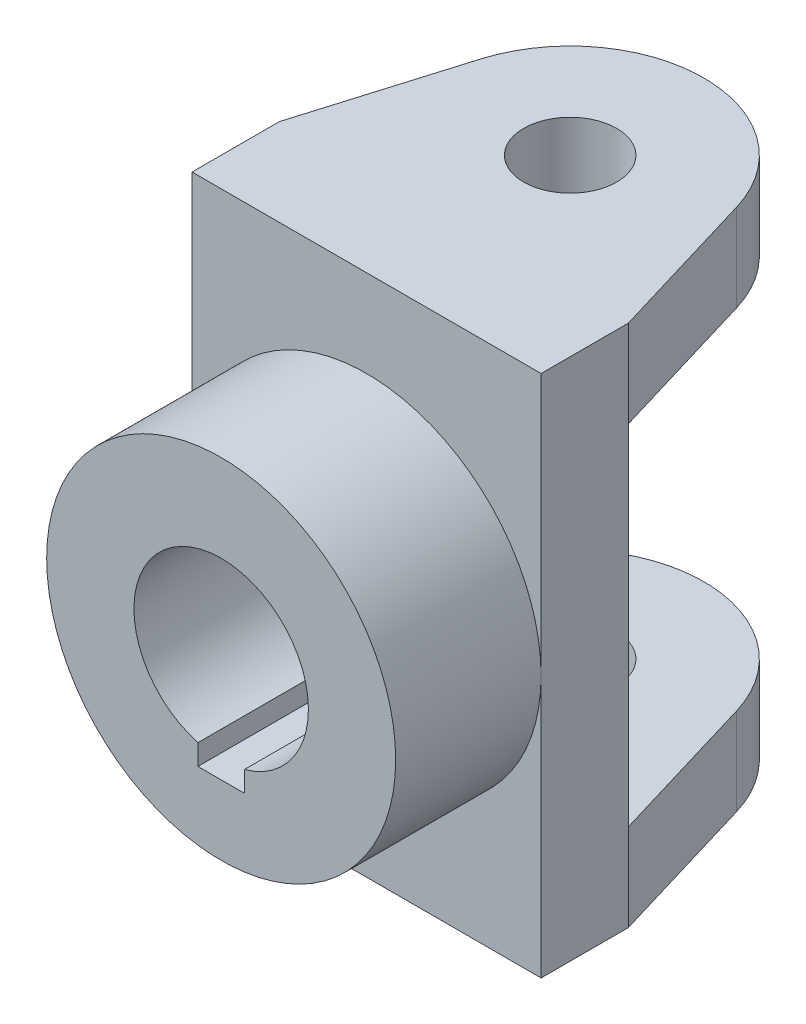
ISO-10303-21;
HEADER;
FILE_DESCRIPTION(('STEP AP214'),'2;1');
FILE_NAME('part.step','',(''),(''),'','','');
FILE_SCHEMA(('AUTOMOTIVE_DESIGN { 1 0 10303 214 1 1 1 1 }'));
ENDSEC;
DATA;
#1=APPLICATION_CONTEXT('core data for automotive mechanical design processes');
#2=APPLICATION_PROTOCOL_DEFINITION('international standard','automotive_design',2000,#1);
#3=PRODUCT_CONTEXT('',#1,'mechanical');
#4=PRODUCT('Part','Part','',(#3));
#5=PRODUCT_RELATED_PRODUCT_CATEGORY('part','',(#4));
#6=PRODUCT_DEFINITION_FORMATION('','',#4);
#7=PRODUCT_DEFINITION_CONTEXT('part definition',#1,'design');
#8=PRODUCT_DEFINITION('design','',#6,#7);
#9=PRODUCT_DEFINITION_SHAPE('','',#8);
#10=(LENGTH_UNIT() NAMED_UNIT(*) SI_UNIT(.MILLI.,.METRE.));
#11=(NAMED_UNIT(*) PLANE_ANGLE_UNIT() SI_UNIT($,.RADIAN.));
#12=(NAMED_UNIT(*) SI_UNIT($,.STERADIAN.) SOLID_ANGLE_UNIT());
#13=UNCERTAINTY_MEASURE_WITH_UNIT(LENGTH_MEASURE(1.E-05),#10,'distance_accuracy_value','');
#14=(GEOMETRIC_REPRESENTATION_CONTEXT(3) GLOBAL_UNCERTAINTY_ASSIGNED_CONTEXT((#13)) GLOBAL_UNIT_ASSIGNED_CONTEXT((#10,
#11,#12)) REPRESENTATION_CONTEXT('',''));
#15=CARTESIAN_POINT('',(0.,0.,0.));
#16=DIRECTION('',(0.,0.,1.));
#17=DIRECTION('',(1.,0.,0.));
#18=AXIS2_PLACEMENT_3D('',#15,#16,#17);
#19=CARTESIAN_POINT('',(0.,0.,0.));
#20=DIRECTION('',(0.,0.,1.));
#21=DIRECTION('',(1.,0.,0.));
#22=AXIS2_PLACEMENT_3D('',#19,#20,#21);
#23=PLANE('',#22);
#24=DIRECTION('',(1.,0.,0.));
#25=VECTOR('',#24,1.);
#26=CARTESIAN_POINT('',(-30.,-30.,0.));
#27=LINE('',#26,#25);
#28=CARTESIAN_POINT('',(-30.,-30.,0.));
#29=VERTEX_POINT('',#28);
#30=CARTESIAN_POINT('',(30.,-30.,0.));
#31=VERTEX_POINT('',#30);
#32=EDGE_CURVE('E149',#29,#31,#27,.T.);
#33=ORIENTED_EDGE('',*,*,#32,.F.);
#34=DIRECTION('',(0.,-1.,0.));
#35=VECTOR('',#34,1.);
#36=CARTESIAN_POINT('',(-30.,-45.,0.));
#37=LINE('',#36,#35);
#38=CARTESIAN_POINT('',(-30.,30.,0.));
#39=VERTEX_POINT('',#38);
#40=EDGE_CURVE('E171',#39,#29,#37,.T.);
#41=ORIENTED_EDGE('',*,*,#40,.F.);
#42=DIRECTION('',(1.,0.,0.));
#43=VECTOR('',#42,1.);
#44=CARTESIAN_POINT('',(-30.,30.,0.));
#45=LINE('',#44,#43);
#46=CARTESIAN_POINT('',(30.,30.,0.));
#47=VERTEX_POINT('',#46);
#48=EDGE_CURVE('E239',#39,#47,#45,.T.);
#49=ORIENTED_EDGE('',*,*,#48,.T.);
#50=DIRECTION('',(0.,1.,0.));
#51=VECTOR('',#50,1.);
#52=CARTESIAN_POINT('',(30.,-45.,0.));
#53=LINE('',#52,#51);
#54=EDGE_CURVE('E49',#31,#47,#53,.T.);
#55=ORIENTED_EDGE('',*,*,#54,.F.);
#56=EDGE_LOOP('',(#33,#41,#49,#55));
#57=FACE_BOUND('',#56,.T.);
#58=ADVANCED_FACE('F32',(#57),#23,.F.);
#59=CARTESIAN_POINT('',(0.,0.,15.));
#60=DIRECTION('',(0.,0.,1.));
#61=DIRECTION('',(1.,0.,0.));
#62=AXIS2_PLACEMENT_3D('',#59,#60,#61);
#63=PLANE('',#62);
#64=CARTESIAN_POINT('',(0.,0.,15.));
#65=DIRECTION('',(0.,0.,1.));
#66=DIRECTION('',(1.,0.,0.));
#67=AXIS2_PLACEMENT_3D('',#64,#65,#66);
#68=CIRCLE('',#67,30.);
#69=CARTESIAN_POINT('',(30.,0.,15.));
#70=VERTEX_POINT('',#69);
#71=CARTESIAN_POINT('',(-30.,0.,15.));
#72=VERTEX_POINT('',#71);
#73=EDGE_CURVE('E42',#70,#72,#68,.T.);
#74=ORIENTED_EDGE('',*,*,#73,.F.);
#75=DIRECTION('',(0.,1.,0.));
#76=VECTOR('',#75,1.);
#77=CARTESIAN_POINT('',(30.,-45.,15.));
#78=LINE('',#77,#76);
#79=CARTESIAN_POINT('',(30.,45.,15.));
#80=VERTEX_POINT('',#79);
#81=EDGE_CURVE('E221',#70,#80,#78,.T.);
#82=ORIENTED_EDGE('',*,*,#81,.T.);
#83=DIRECTION('',(-1.,0.,0.));
#84=VECTOR('',#83,1.);
#85=CARTESIAN_POINT('',(30.,45.,15.));
#86=LINE('',#85,#84);
#87=CARTESIAN_POINT('',(-30.,45.,15.));
#88=VERTEX_POINT('',#87);
#89=EDGE_CURVE('E183',#80,#88,#86,.T.);
#90=ORIENTED_EDGE('',*,*,#89,.T.);
#91=DIRECTION('',(0.,-1.,0.));
#92=VECTOR('',#91,1.);
#93=CARTESIAN_POINT('',(-30.,-45.,15.));
#94=LINE('',#93,#92);
#95=EDGE_CURVE('E205',#88,#72,#94,.T.);
#96=ORIENTED_EDGE('',*,*,#95,.T.);
#97=EDGE_LOOP('',(#74,#82,#90,#96));
#98=FACE_BOUND('',#97,.T.);
#99=ADVANCED_FACE('F211',(#98),#63,.T.);
#100=CARTESIAN_POINT('',(-30.,-45.,15.));
#101=DIRECTION('',(1.,0.,0.));
#102=DIRECTION('',(0.,0.,-1.));
#103=AXIS2_PLACEMENT_3D('',#100,#101,#102);
#104=PLANE('',#103);
#105=CARTESIAN_POINT('',(-30.,45.,0.));
#106=VERTEX_POINT('',#105);
#107=EDGE_CURVE('E176',#106,#39,#37,.T.);
#108=ORIENTED_EDGE('',*,*,#107,.T.);
#109=ORIENTED_EDGE('',*,*,#40,.T.);
#110=DIRECTION('',(0.,-1.,0.));
#111=VECTOR('',#110,1.);
#112=CARTESIAN_POINT('',(-30.,-30.,0.));
#113=LINE('',#112,#111);
#114=CARTESIAN_POINT('',(-30.,-45.,0.));
#115=VERTEX_POINT('',#114);
#116=EDGE_CURVE('E157',#29,#115,#113,.T.);
#117=ORIENTED_EDGE('',*,*,#116,.T.);
#118=DIRECTION('',(0.,0.,-1.));
#119=VECTOR('',#118,1.);
#120=CARTESIAN_POINT('',(-30.,-45.,15.));
#121=LINE('',#120,#119);
#122=CARTESIAN_POINT('',(-30.,-45.,15.));
#123=VERTEX_POINT('',#122);
#124=EDGE_CURVE('E36',#123,#115,#121,.T.);
#125=ORIENTED_EDGE('',*,*,#124,.F.);
#126=EDGE_CURVE('E187',#72,#123,#94,.T.);
#127=ORIENTED_EDGE('',*,*,#126,.F.);
#128=ORIENTED_EDGE('',*,*,#95,.F.);
#129=DIRECTION('',(0.,0.,-1.));
#130=VECTOR('',#129,1.);
#131=CARTESIAN_POINT('',(-30.,45.,15.));
#132=LINE('',#131,#130);
#133=EDGE_CURVE('E188',#88,#106,#132,.T.);
#134=ORIENTED_EDGE('',*,*,#133,.T.);
#135=EDGE_LOOP('',(#108,#109,#117,#125,#127,#128,#134));
#136=FACE_BOUND('',#135,.T.);
#137=ADVANCED_FACE('F34',(#136),#104,.F.);
#138=CARTESIAN_POINT('',(30.,-45.,15.));
#139=DIRECTION('',(0.,1.,0.));
#140=DIRECTION('',(-1.,0.,0.));
#141=AXIS2_PLACEMENT_3D('',#138,#139,#140);
#142=PLANE('',#141);
#143=ORIENTED_EDGE('',*,*,#124,.T.);
#144=DIRECTION('',(-0.286928155857607,0.,0.957952103905072));
#145=VECTOR('',#144,1.);
#146=CARTESIAN_POINT('',(-30.,-45.,0.));
#147=LINE('',#146,#145);
#148=CARTESIAN_POINT('',(-22.0328983898167,-45.,-26.599347584725));
#149=VERTEX_POINT('',#148);
#150=EDGE_CURVE('E160',#149,#115,#147,.T.);
#151=ORIENTED_EDGE('',*,*,#150,.F.);
#152=CARTESIAN_POINT('',(0.,-45.,-20.));
#153=DIRECTION('',(0.,1.,0.));
#154=DIRECTION('',(-1.,0.,0.));
#155=AXIS2_PLACEMENT_3D('',#152,#153,#154);
#156=CIRCLE('',#155,23.);
#157=CARTESIAN_POINT('',(22.0328983898166,-45.,-26.599347584725));
#158=VERTEX_POINT('',#157);
#159=EDGE_CURVE('E512',#158,#149,#156,.T.);
#160=ORIENTED_EDGE('',*,*,#159,.F.);
#161=DIRECTION('',(-0.286928155857607,0.,-0.957952103905071));
#162=VECTOR('',#161,1.);
#163=CARTESIAN_POINT('',(30.,-45.,0.));
#164=LINE('',#163,#162);
#165=CARTESIAN_POINT('',(30.,-45.,0.));
#166=VERTEX_POINT('',#165);
#167=EDGE_CURVE('E173',#166,#158,#164,.T.);
#168=ORIENTED_EDGE('',*,*,#167,.F.);
#169=DIRECTION('',(0.,0.,-1.));
#170=VECTOR('',#169,1.);
#171=CARTESIAN_POINT('',(30.,-45.,15.));
#172=LINE('',#171,#170);
#173=CARTESIAN_POINT('',(30.,-45.,15.));
#174=VERTEX_POINT('',#173);
#175=EDGE_CURVE('E192',#174,#166,#172,.T.);
#176=ORIENTED_EDGE('',*,*,#175,.F.);
#177=DIRECTION('',(1.,0.,0.));
#178=VECTOR('',#177,1.);
#179=CARTESIAN_POINT('',(30.,-45.,15.));
#180=LINE('',#179,#178);
#181=EDGE_CURVE('E201',#123,#174,#180,.T.);
#182=ORIENTED_EDGE('',*,*,#181,.F.);
#183=EDGE_LOOP('',(#143,#151,#160,#168,#176,#182));
#184=FACE_BOUND('',#183,.T.);
#185=CARTESIAN_POINT('',(0.,-45.,-20.));
#186=DIRECTION('',(0.,1.,0.));
#187=DIRECTION('',(-1.,0.,0.));
#188=AXIS2_PLACEMENT_3D('',#185,#186,#187);
#189=CIRCLE('',#188,8.);
#190=CARTESIAN_POINT('',(8.,-45.,-20.));
#191=VERTEX_POINT('',#190);
#192=EDGE_CURVE('E505',#191,#191,#189,.T.);
#193=ORIENTED_EDGE('',*,*,#192,.T.);
#194=EDGE_LOOP('',(#193));
#195=FACE_BOUND('',#194,.T.);
#196=ADVANCED_FACE('F198',(#184,#195),#142,.F.);
#197=CARTESIAN_POINT('',(30.,-45.,15.));
#198=DIRECTION('',(-1.,0.,0.));
#199=DIRECTION('',(0.,0.,1.));
#200=AXIS2_PLACEMENT_3D('',#197,#198,#199);
#201=PLANE('',#200);
#202=EDGE_CURVE('E185',#166,#31,#53,.T.);
#203=ORIENTED_EDGE('',*,*,#202,.T.);
#204=ORIENTED_EDGE('',*,*,#54,.T.);
#205=DIRECTION('',(0.,1.,0.));
#206=VECTOR('',#205,1.);
#207=CARTESIAN_POINT('',(30.,30.,0.));
#208=LINE('',#207,#206);
#209=CARTESIAN_POINT('',(30.,45.,0.));
#210=VERTEX_POINT('',#209);
#211=EDGE_CURVE('E227',#47,#210,#208,.T.);
#212=ORIENTED_EDGE('',*,*,#211,.T.);
#213=DIRECTION('',(0.,0.,-1.));
#214=VECTOR('',#213,1.);
#215=CARTESIAN_POINT('',(30.,45.,15.));
#216=LINE('',#215,#214);
#217=EDGE_CURVE('E190',#80,#210,#216,.T.);
#218=ORIENTED_EDGE('',*,*,#217,.F.);
#219=ORIENTED_EDGE('',*,*,#81,.F.);
#220=EDGE_CURVE('E222',#174,#70,#78,.T.);
#221=ORIENTED_EDGE('',*,*,#220,.F.);
#222=ORIENTED_EDGE('',*,*,#175,.T.);
#223=EDGE_LOOP('',(#203,#204,#212,#218,#219,#221,#222));
#224=FACE_BOUND('',#223,.T.);
#225=ADVANCED_FACE('F225',(#224),#201,.F.);
#226=CARTESIAN_POINT('',(30.,45.,15.));
#227=DIRECTION('',(0.,-1.,0.));
#228=DIRECTION('',(1.,0.,0.));
#229=AXIS2_PLACEMENT_3D('',#226,#227,#228);
#230=PLANE('',#229);
#231=ORIENTED_EDGE('',*,*,#217,.T.);
#232=DIRECTION('',(-0.286928155857607,0.,-0.957952103905071));
#233=VECTOR('',#232,1.);
#234=CARTESIAN_POINT('',(30.,45.,0.));
#235=LINE('',#234,#233);
#236=CARTESIAN_POINT('',(22.0328983898166,45.,-26.599347584725));
#237=VERTEX_POINT('',#236);
#238=EDGE_CURVE('E243',#210,#237,#235,.T.);
#239=ORIENTED_EDGE('',*,*,#238,.T.);
#240=CARTESIAN_POINT('',(0.,45.,-20.));
#241=DIRECTION('',(0.,1.,0.));
#242=DIRECTION('',(-1.,0.,0.));
#243=AXIS2_PLACEMENT_3D('',#240,#241,#242);
#244=CIRCLE('',#243,23.);
#245=CARTESIAN_POINT('',(-22.0328983898167,45.,-26.599347584725));
#246=VERTEX_POINT('',#245);
#247=EDGE_CURVE('E237',#237,#246,#244,.T.);
#248=ORIENTED_EDGE('',*,*,#247,.T.);
#249=DIRECTION('',(-0.286928155857607,0.,0.957952103905072));
#250=VECTOR('',#249,1.);
#251=CARTESIAN_POINT('',(-30.,45.,0.));
#252=LINE('',#251,#250);
#253=EDGE_CURVE('E235',#246,#106,#252,.T.);
#254=ORIENTED_EDGE('',*,*,#253,.T.);
#255=ORIENTED_EDGE('',*,*,#133,.F.);
#256=ORIENTED_EDGE('',*,*,#89,.F.);
#257=EDGE_LOOP('',(#231,#239,#248,#254,#255,#256));
#258=FACE_BOUND('',#257,.T.);
#259=CARTESIAN_POINT('',(0.,45.,-20.));
#260=DIRECTION('',(0.,1.,0.));
#261=DIRECTION('',(-1.,0.,0.));
#262=AXIS2_PLACEMENT_3D('',#259,#260,#261);
#263=CIRCLE('',#262,8.);
#264=CARTESIAN_POINT('',(-8.00000000000001,45.,-20.));
#265=VERTEX_POINT('',#264);
#266=EDGE_CURVE('E518',#265,#265,#263,.T.);
#267=ORIENTED_EDGE('',*,*,#266,.F.);
#268=EDGE_LOOP('',(#267));
#269=FACE_BOUND('',#268,.T.);
#270=ADVANCED_FACE('F230',(#258,#269),#230,.F.);
#271=EDGE_CURVE('E11',#72,#70,#68,.T.);
#272=ORIENTED_EDGE('',*,*,#271,.F.);
#273=ORIENTED_EDGE('',*,*,#126,.T.);
#274=ORIENTED_EDGE('',*,*,#181,.T.);
#275=ORIENTED_EDGE('',*,*,#220,.T.);
#276=EDGE_LOOP('',(#272,#273,#274,#275));
#277=FACE_BOUND('',#276,.T.);
#278=ADVANCED_FACE('F303',(#277),#63,.T.);
#279=CARTESIAN_POINT('',(0.,0.,40.));
#280=DIRECTION('',(0.,0.,1.));
#281=DIRECTION('',(1.,0.,0.));
#282=AXIS2_PLACEMENT_3D('',#279,#280,#281);
#283=PLANE('',#282);
#284=CARTESIAN_POINT('',(0.,0.,40.));
#285=DIRECTION('',(0.,0.,1.));
#286=DIRECTION('',(1.,0.,0.));
#287=AXIS2_PLACEMENT_3D('',#284,#285,#286);
#288=CIRCLE('',#287,30.);
#289=CARTESIAN_POINT('',(30.,0.,40.));
#290=VERTEX_POINT('',#289);
#291=EDGE_CURVE('E177',#290,#290,#288,.T.);
#292=ORIENTED_EDGE('',*,*,#291,.T.);
#293=EDGE_LOOP('',(#292));
#294=FACE_BOUND('',#293,.T.);
#295=DIRECTION('',(0.,1.,0.));
#296=VECTOR('',#295,1.);
#297=CARTESIAN_POINT('',(4.,-14.456832294801,40.));
#298=LINE('',#297,#296);
#299=CARTESIAN_POINT('',(4.,-18.,40.));
#300=VERTEX_POINT('',#299);
#301=CARTESIAN_POINT('',(4.,-14.456832294801,40.));
#302=VERTEX_POINT('',#301);
#303=EDGE_CURVE('E256',#300,#302,#298,.T.);
#304=ORIENTED_EDGE('',*,*,#303,.F.);
#305=DIRECTION('',(1.,0.,0.));
#306=VECTOR('',#305,1.);
#307=CARTESIAN_POINT('',(-4.,-18.,40.));
#308=LINE('',#307,#306);
#309=CARTESIAN_POINT('',(-4.,-18.,40.));
#310=VERTEX_POINT('',#309);
#311=EDGE_CURVE('E254',#310,#300,#308,.T.);
#312=ORIENTED_EDGE('',*,*,#311,.F.);
#313=DIRECTION('',(0.,-1.,0.));
#314=VECTOR('',#313,1.);
#315=CARTESIAN_POINT('',(-4.,-14.456832294801,40.));
#316=LINE('',#315,#314);
#317=CARTESIAN_POINT('',(-4.,-14.456832294801,40.));
#318=VERTEX_POINT('',#317);
#319=EDGE_CURVE('E262',#318,#310,#316,.T.);
#320=ORIENTED_EDGE('',*,*,#319,.F.);
#321=CARTESIAN_POINT('',(0.,0.,40.));
#322=DIRECTION('',(0.,0.,1.));
#323=DIRECTION('',(1.,0.,0.));
#324=AXIS2_PLACEMENT_3D('',#321,#322,#323);
#325=CIRCLE('',#324,15.);
#326=EDGE_CURVE('E259',#302,#318,#325,.T.);
#327=ORIENTED_EDGE('',*,*,#326,.F.);
#328=EDGE_LOOP('',(#304,#312,#320,#327));
#329=FACE_BOUND('',#328,.T.);
#330=ADVANCED_FACE('F292',(#294,#329),#283,.T.);
#331=CARTESIAN_POINT('',(0.,0.,40.));
#332=DIRECTION('',(0.,0.,-1.));
#333=DIRECTION('',(-1.,0.,0.));
#334=AXIS2_PLACEMENT_3D('',#331,#332,#333);
#335=CYLINDRICAL_SURFACE('',#334,30.);
#336=ORIENTED_EDGE('',*,*,#291,.F.);
#337=EDGE_LOOP('',(#336));
#338=FACE_BOUND('',#337,.T.);
#339=ORIENTED_EDGE('',*,*,#73,.T.);
#340=ORIENTED_EDGE('',*,*,#271,.T.);
#341=EDGE_LOOP('',(#339,#340));
#342=FACE_BOUND('',#341,.T.);
#343=ADVANCED_FACE('F215',(#338,#342),#335,.T.);
#344=CARTESIAN_POINT('',(-4.,-18.,40.));
#345=DIRECTION('',(0.,1.,0.));
#346=DIRECTION('',(0.,0.,1.));
#347=AXIS2_PLACEMENT_3D('',#344,#345,#346);
#348=PLANE('',#347);
#349=DIRECTION('',(1.,0.,0.));
#350=VECTOR('',#349,1.);
#351=CARTESIAN_POINT('',(-4.,-18.,15.));
#352=LINE('',#351,#350);
#353=CARTESIAN_POINT('',(-4.,-18.,15.));
#354=VERTEX_POINT('',#353);
#355=CARTESIAN_POINT('',(4.,-18.,15.));
#356=VERTEX_POINT('',#355);
#357=EDGE_CURVE('E249',#354,#356,#352,.T.);
#358=ORIENTED_EDGE('',*,*,#357,.F.);
#359=DIRECTION('',(0.,0.,-1.));
#360=VECTOR('',#359,1.);
#361=CARTESIAN_POINT('',(-4.,-18.,40.));
#362=LINE('',#361,#360);
#363=EDGE_CURVE('E57',#310,#354,#362,.T.);
#364=ORIENTED_EDGE('',*,*,#363,.F.);
#365=ORIENTED_EDGE('',*,*,#311,.T.);
#366=DIRECTION('',(0.,0.,-1.));
#367=VECTOR('',#366,1.);
#368=CARTESIAN_POINT('',(4.,-18.,40.));
#369=LINE('',#368,#367);
#370=EDGE_CURVE('E216',#300,#356,#369,.T.);
#371=ORIENTED_EDGE('',*,*,#370,.T.);
#372=EDGE_LOOP('',(#358,#364,#365,#371));
#373=FACE_BOUND('',#372,.T.);
#374=ADVANCED_FACE('F289',(#373),#348,.T.);
#375=CARTESIAN_POINT('',(4.,-14.456832294801,40.));
#376=DIRECTION('',(-1.,0.,0.));
#377=DIRECTION('',(0.,0.,1.));
#378=AXIS2_PLACEMENT_3D('',#375,#376,#377);
#379=PLANE('',#378);
#380=DIRECTION('',(0.,1.,0.));
#381=VECTOR('',#380,1.);
#382=CARTESIAN_POINT('',(4.,-14.456832294801,15.));
#383=LINE('',#382,#381);
#384=CARTESIAN_POINT('',(4.,-14.456832294801,15.));
#385=VERTEX_POINT('',#384);
#386=EDGE_CURVE('E266',#356,#385,#383,.T.);
#387=ORIENTED_EDGE('',*,*,#386,.F.);
#388=ORIENTED_EDGE('',*,*,#370,.F.);
#389=ORIENTED_EDGE('',*,*,#303,.T.);
#390=DIRECTION('',(0.,0.,-1.));
#391=VECTOR('',#390,1.);
#392=CARTESIAN_POINT('',(4.,-14.456832294801,40.));
#393=LINE('',#392,#391);
#394=EDGE_CURVE('E218',#302,#385,#393,.T.);
#395=ORIENTED_EDGE('',*,*,#394,.T.);
#396=EDGE_LOOP('',(#387,#388,#389,#395));
#397=FACE_BOUND('',#396,.T.);
#398=ADVANCED_FACE('F280',(#397),#379,.T.);
#399=CARTESIAN_POINT('',(0.,0.,40.));
#400=DIRECTION('',(0.,0.,-1.));
#401=DIRECTION('',(-1.,0.,0.));
#402=AXIS2_PLACEMENT_3D('',#399,#400,#401);
#403=CYLINDRICAL_SURFACE('',#402,15.);
#404=CARTESIAN_POINT('',(0.,0.,15.));
#405=DIRECTION('',(0.,0.,1.));
#406=DIRECTION('',(1.,0.,0.));
#407=AXIS2_PLACEMENT_3D('',#404,#405,#406);
#408=CIRCLE('',#407,15.);
#409=CARTESIAN_POINT('',(-4.,-14.456832294801,15.));
#410=VERTEX_POINT('',#409);
#411=EDGE_CURVE('E269',#385,#410,#408,.T.);
#412=ORIENTED_EDGE('',*,*,#411,.F.);
#413=ORIENTED_EDGE('',*,*,#394,.F.);
#414=ORIENTED_EDGE('',*,*,#326,.T.);
#415=DIRECTION('',(0.,0.,-1.));
#416=VECTOR('',#415,1.);
#417=CARTESIAN_POINT('',(-4.,-14.456832294801,40.));
#418=LINE('',#417,#416);
#419=EDGE_CURVE('E275',#318,#410,#418,.T.);
#420=ORIENTED_EDGE('',*,*,#419,.T.);
#421=EDGE_LOOP('',(#412,#413,#414,#420));
#422=FACE_BOUND('',#421,.T.);
#423=ADVANCED_FACE('F285',(#422),#403,.F.);
#424=CARTESIAN_POINT('',(-4.,-14.456832294801,40.));
#425=DIRECTION('',(1.,0.,0.));
#426=DIRECTION('',(0.,0.,-1.));
#427=AXIS2_PLACEMENT_3D('',#424,#425,#426);
#428=PLANE('',#427);
#429=DIRECTION('',(0.,-1.,0.));
#430=VECTOR('',#429,1.);
#431=CARTESIAN_POINT('',(-4.,-14.456832294801,15.));
#432=LINE('',#431,#430);
#433=EDGE_CURVE('E257',#410,#354,#432,.T.);
#434=ORIENTED_EDGE('',*,*,#433,.F.);
#435=ORIENTED_EDGE('',*,*,#419,.F.);
#436=ORIENTED_EDGE('',*,*,#319,.T.);
#437=ORIENTED_EDGE('',*,*,#363,.T.);
#438=EDGE_LOOP('',(#434,#435,#436,#437));
#439=FACE_BOUND('',#438,.T.);
#440=ADVANCED_FACE('F294',(#439),#428,.T.);
#441=ORIENTED_EDGE('',*,*,#433,.T.);
#442=ORIENTED_EDGE('',*,*,#357,.T.);
#443=ORIENTED_EDGE('',*,*,#386,.T.);
#444=ORIENTED_EDGE('',*,*,#411,.T.);
#445=EDGE_LOOP('',(#441,#442,#443,#444));
#446=FACE_BOUND('',#445,.T.);
#447=ADVANCED_FACE('F287',(#446),#63,.T.);
#448=CARTESIAN_POINT('',(-30.,30.,0.));
#449=DIRECTION('',(-0.957952103905072,0.,-0.286928155857607));
#450=DIRECTION('',(-0.286928155857607,0.,0.957952103905072));
#451=AXIS2_PLACEMENT_3D('',#448,#449,#450);
#452=PLANE('',#451);
#453=ORIENTED_EDGE('',*,*,#253,.F.);
#454=DIRECTION('',(0.,1.,0.));
#455=VECTOR('',#454,1.);
#456=CARTESIAN_POINT('',(-22.0328983898167,30.,-26.599347584725));
#457=LINE('',#456,#455);
#458=CARTESIAN_POINT('',(-22.0328983898167,30.,-26.599347584725));
#459=VERTEX_POINT('',#458);
#460=EDGE_CURVE('E247',#459,#246,#457,.T.);
#461=ORIENTED_EDGE('',*,*,#460,.F.);
#462=DIRECTION('',(-0.286928155857607,0.,0.957952103905072));
#463=VECTOR('',#462,1.);
#464=CARTESIAN_POINT('',(-30.,30.,0.));
#465=LINE('',#464,#463);
#466=EDGE_CURVE('E253',#459,#39,#465,.T.);
#467=ORIENTED_EDGE('',*,*,#466,.T.);
#468=ORIENTED_EDGE('',*,*,#107,.F.);
#469=EDGE_LOOP('',(#453,#461,#467,#468));
#470=FACE_BOUND('',#469,.T.);
#471=ADVANCED_FACE('F301',(#470),#452,.T.);
#472=CARTESIAN_POINT('',(0.,30.,-20.));
#473=DIRECTION('',(0.,1.,0.));
#474=DIRECTION('',(-1.,0.,0.));
#475=AXIS2_PLACEMENT_3D('',#472,#473,#474);
#476=CYLINDRICAL_SURFACE('',#475,23.);
#477=ORIENTED_EDGE('',*,*,#247,.F.);
#478=DIRECTION('',(0.,1.,0.));
#479=VECTOR('',#478,1.);
#480=CARTESIAN_POINT('',(22.0328983898166,30.,-26.599347584725));
#481=LINE('',#480,#479);
#482=CARTESIAN_POINT('',(22.0328983898166,30.,-26.599347584725));
#483=VERTEX_POINT('',#482);
#484=EDGE_CURVE('E250',#483,#237,#481,.T.);
#485=ORIENTED_EDGE('',*,*,#484,.F.);
#486=CARTESIAN_POINT('',(0.,30.,-20.));
#487=DIRECTION('',(0.,1.,0.));
#488=DIRECTION('',(-1.,0.,0.));
#489=AXIS2_PLACEMENT_3D('',#486,#487,#488);
#490=CIRCLE('',#489,23.);
#491=EDGE_CURVE('E527',#483,#459,#490,.T.);
#492=ORIENTED_EDGE('',*,*,#491,.T.);
#493=ORIENTED_EDGE('',*,*,#460,.T.);
#494=EDGE_LOOP('',(#477,#485,#492,#493));
#495=FACE_BOUND('',#494,.T.);
#496=ADVANCED_FACE('F398',(#495),#476,.T.);
#497=CARTESIAN_POINT('',(30.,30.,0.));
#498=DIRECTION('',(0.957952103905071,0.,-0.286928155857607));
#499=DIRECTION('',(-0.286928155857607,0.,-0.957952103905071));
#500=AXIS2_PLACEMENT_3D('',#497,#498,#499);
#501=PLANE('',#500);
#502=ORIENTED_EDGE('',*,*,#238,.F.);
#503=ORIENTED_EDGE('',*,*,#211,.F.);
#504=DIRECTION('',(-0.286928155857607,0.,-0.957952103905071));
#505=VECTOR('',#504,1.);
#506=CARTESIAN_POINT('',(30.,30.,0.));
#507=LINE('',#506,#505);
#508=EDGE_CURVE('E241',#47,#483,#507,.T.);
#509=ORIENTED_EDGE('',*,*,#508,.T.);
#510=ORIENTED_EDGE('',*,*,#484,.T.);
#511=EDGE_LOOP('',(#502,#503,#509,#510));
#512=FACE_BOUND('',#511,.T.);
#513=ADVANCED_FACE('F407',(#512),#501,.T.);
#514=CARTESIAN_POINT('',(0.,30.,-20.));
#515=DIRECTION('',(0.,1.,0.));
#516=DIRECTION('',(-1.,0.,0.));
#517=AXIS2_PLACEMENT_3D('',#514,#515,#516);
#518=PLANE('',#517);
#519=CARTESIAN_POINT('',(0.,30.,-20.));
#520=DIRECTION('',(0.,1.,0.));
#521=DIRECTION('',(-1.,0.,0.));
#522=AXIS2_PLACEMENT_3D('',#519,#520,#521);
#523=CIRCLE('',#522,8.);
#524=CARTESIAN_POINT('',(-8.00000000000001,30.,-20.));
#525=VERTEX_POINT('',#524);
#526=EDGE_CURVE('E520',#525,#525,#523,.T.);
#527=ORIENTED_EDGE('',*,*,#526,.T.);
#528=EDGE_LOOP('',(#527));
#529=FACE_BOUND('',#528,.T.);
#530=ORIENTED_EDGE('',*,*,#48,.F.);
#531=ORIENTED_EDGE('',*,*,#466,.F.);
#532=ORIENTED_EDGE('',*,*,#491,.F.);
#533=ORIENTED_EDGE('',*,*,#508,.F.);
#534=EDGE_LOOP('',(#530,#531,#532,#533));
#535=FACE_BOUND('',#534,.T.);
#536=ADVANCED_FACE('F417',(#529,#535),#518,.F.);
#537=CARTESIAN_POINT('',(0.,30.,-20.));
#538=DIRECTION('',(0.,1.,0.));
#539=DIRECTION('',(-1.,0.,0.));
#540=AXIS2_PLACEMENT_3D('',#537,#538,#539);
#541=CYLINDRICAL_SURFACE('',#540,8.);
#542=CARTESIAN_POINT('',(-8.00000000000001,30.,-20.));
#543=CARTESIAN_POINT('',(-8.00000000000001,30.15625,-20.));
#544=CARTESIAN_POINT('',(-8.00000000000001,30.3125,-20.));
#545=CARTESIAN_POINT('',(-8.00000000000001,30.625,-20.));
#546=CARTESIAN_POINT('',(-8.00000000000001,30.78125,-20.));
#547=CARTESIAN_POINT('',(-8.00000000000001,31.09375,-20.));
#548=CARTESIAN_POINT('',(-8.00000000000001,31.25,-20.));
#549=CARTESIAN_POINT('',(-8.00000000000001,31.5625,-20.));
#550=CARTESIAN_POINT('',(-8.00000000000001,31.71875,-20.));
#551=CARTESIAN_POINT('',(-8.00000000000001,32.03125,-20.));
#552=CARTESIAN_POINT('',(-8.00000000000001,32.1875,-20.));
#553=CARTESIAN_POINT('',(-8.00000000000001,32.5,-20.));
#554=CARTESIAN_POINT('',(-8.00000000000001,32.65625,-20.));
#555=CARTESIAN_POINT('',(-8.00000000000001,32.96875,-20.));
#556=CARTESIAN_POINT('',(-8.00000000000001,33.125,-20.));
#557=CARTESIAN_POINT('',(-8.00000000000001,33.4375,-20.));
#558=CARTESIAN_POINT('',(-8.00000000000001,33.59375,-20.));
#559=CARTESIAN_POINT('',(-8.00000000000001,33.90625,-20.));
#560=CARTESIAN_POINT('',(-8.00000000000001,34.0625,-20.));
#561=CARTESIAN_POINT('',(-8.00000000000001,34.375,-20.));
#562=CARTESIAN_POINT('',(-8.00000000000001,34.53125,-20.));
#563=CARTESIAN_POINT('',(-8.00000000000001,34.84375,-20.));
#564=CARTESIAN_POINT('',(-8.00000000000001,35.,-20.));
#565=CARTESIAN_POINT('',(-8.00000000000001,35.3125,-20.));
#566=CARTESIAN_POINT('',(-8.00000000000001,35.46875,-20.));
#567=CARTESIAN_POINT('',(-8.00000000000001,35.78125,-20.));
#568=CARTESIAN_POINT('',(-8.00000000000001,35.9375,-20.));
#569=CARTESIAN_POINT('',(-8.00000000000001,36.25,-20.));
#570=CARTESIAN_POINT('',(-8.00000000000001,36.40625,-20.));
#571=CARTESIAN_POINT('',(-8.00000000000001,36.71875,-20.));
#572=CARTESIAN_POINT('',(-8.00000000000001,36.875,-20.));
#573=CARTESIAN_POINT('',(-8.00000000000001,37.1875,-20.));
#574=CARTESIAN_POINT('',(-8.00000000000001,37.34375,-20.));
#575=CARTESIAN_POINT('',(-8.00000000000001,37.65625,-20.));
#576=CARTESIAN_POINT('',(-8.00000000000001,37.8125,-20.));
#577=CARTESIAN_POINT('',(-8.00000000000001,38.125,-20.));
#578=CARTESIAN_POINT('',(-8.00000000000001,38.28125,-20.));
#579=CARTESIAN_POINT('',(-8.00000000000001,38.59375,-20.));
#580=CARTESIAN_POINT('',(-8.00000000000001,38.75,-20.));
#581=CARTESIAN_POINT('',(-8.00000000000001,39.0625,-20.));
#582=CARTESIAN_POINT('',(-8.00000000000001,39.21875,-20.));
#583=CARTESIAN_POINT('',(-8.00000000000001,39.53125,-20.));
#584=CARTESIAN_POINT('',(-8.00000000000001,39.6875,-20.));
#585=CARTESIAN_POINT('',(-8.00000000000001,40.,-20.));
#586=CARTESIAN_POINT('',(-8.00000000000001,40.15625,-20.));
#587=CARTESIAN_POINT('',(-8.00000000000001,40.46875,-20.));
#588=CARTESIAN_POINT('',(-8.00000000000001,40.625,-20.));
#589=CARTESIAN_POINT('',(-8.00000000000001,40.9375,-20.));
#590=CARTESIAN_POINT('',(-8.00000000000001,41.09375,-20.));
#591=CARTESIAN_POINT('',(-8.00000000000001,41.40625,-20.));
#592=CARTESIAN_POINT('',(-8.00000000000001,41.5625,-20.));
#593=CARTESIAN_POINT('',(-8.00000000000001,41.875,-20.));
#594=CARTESIAN_POINT('',(-8.00000000000001,42.03125,-20.));
#595=CARTESIAN_POINT('',(-8.00000000000001,42.34375,-20.));
#596=CARTESIAN_POINT('',(-8.00000000000001,42.5,-20.));
#597=CARTESIAN_POINT('',(-8.00000000000001,42.8125,-20.));
#598=CARTESIAN_POINT('',(-8.00000000000001,42.96875,-20.));
#599=CARTESIAN_POINT('',(-8.00000000000001,43.28125,-20.));
#600=CARTESIAN_POINT('',(-8.00000000000001,43.4375,-20.));
#601=CARTESIAN_POINT('',(-8.00000000000001,43.75,-20.));
#602=CARTESIAN_POINT('',(-8.00000000000001,43.90625,-20.));
#603=CARTESIAN_POINT('',(-8.00000000000001,44.21875,-20.));
#604=CARTESIAN_POINT('',(-8.00000000000001,44.375,-20.));
#605=CARTESIAN_POINT('',(-8.00000000000001,44.6875,-20.));
#606=CARTESIAN_POINT('',(-8.00000000000001,44.84375,-20.));
#607=CARTESIAN_POINT('',(-8.00000000000001,45.,-20.));
#608=B_SPLINE_CURVE_WITH_KNOTS('',3,(#542,#543,#544,#545,#546,#547,#548,#549,#550,#551,#552,
#553,#554,#555,#556,#557,#558,#559,#560,#561,#562,#563,#564,#565,#566,#567,#568,#569,#570,#571,
#572,#573,#574,#575,#576,#577,#578,#579,#580,#581,#582,#583,#584,#585,#586,#587,#588,#589,#590,
#591,#592,#593,#594,#595,#596,#597,#598,#599,#600,#601,#602,#603,#604,#605,#606,#607),
.UNSPECIFIED.,.F.,.F.,(4,2,2,2,2,2,2,2,2,2,2,2,2,2,2,2,2,2,2,2,2,2,2,2,2,2,2,2,2,2,2,2,4),(0.,
0.46875,0.937500000000001,1.40625,1.875,2.34375,2.8125,3.28125,3.75,4.21875,4.6875,5.15625,
5.625,6.09375,6.5625,7.03125,7.5,7.96875,8.4375,8.90625,9.37500000000001,9.84375,10.3125,
10.78125,11.25,11.71875,12.1875,12.65625,13.125,13.59375,14.0625,14.53125,15.),.UNSPECIFIED.);
#609=EDGE_CURVE('BSEAM426',#525,#265,#608,.T.);
#610=ORIENTED_EDGE('',*,*,#526,.F.);
#611=ORIENTED_EDGE('',*,*,#266,.T.);
#612=ORIENTED_EDGE('',*,*,#609,.T.);
#613=ORIENTED_EDGE('',*,*,#609,.F.);
#614=EDGE_LOOP('',(#610,#612,#611,#613));
#615=FACE_BOUND('',#614,.T.);
#616=ADVANCED_FACE('F426',(#615),#541,.F.);
#617=CARTESIAN_POINT('',(0.,-30.,-20.));
#618=DIRECTION('',(0.,-1.,0.));
#619=DIRECTION('',(-1.,0.,0.));
#620=AXIS2_PLACEMENT_3D('',#617,#618,#619);
#621=PLANE('',#620);
#622=ORIENTED_EDGE('',*,*,#32,.T.);
#623=DIRECTION('',(-0.286928155857607,0.,-0.957952103905071));
#624=VECTOR('',#623,1.);
#625=CARTESIAN_POINT('',(30.,-30.,0.));
#626=LINE('',#625,#624);
#627=CARTESIAN_POINT('',(22.0328983898166,-30.,-26.599347584725));
#628=VERTEX_POINT('',#627);
#629=EDGE_CURVE('E166',#31,#628,#626,.T.);
#630=ORIENTED_EDGE('',*,*,#629,.T.);
#631=CARTESIAN_POINT('',(0.,-30.,-20.));
#632=DIRECTION('',(0.,1.,0.));
#633=DIRECTION('',(-1.,0.,0.));
#634=AXIS2_PLACEMENT_3D('',#631,#632,#633);
#635=CIRCLE('',#634,23.);
#636=CARTESIAN_POINT('',(-22.0328983898167,-30.,-26.599347584725));
#637=VERTEX_POINT('',#636);
#638=EDGE_CURVE('E151',#628,#637,#635,.T.);
#639=ORIENTED_EDGE('',*,*,#638,.T.);
#640=DIRECTION('',(-0.286928155857607,0.,0.957952103905072));
#641=VECTOR('',#640,1.);
#642=CARTESIAN_POINT('',(-30.,-30.,0.));
#643=LINE('',#642,#641);
#644=EDGE_CURVE('E144',#637,#29,#643,.T.);
#645=ORIENTED_EDGE('',*,*,#644,.T.);
#646=EDGE_LOOP('',(#622,#630,#639,#645));
#647=FACE_BOUND('',#646,.T.);
#648=CARTESIAN_POINT('',(0.,-30.,-20.));
#649=DIRECTION('',(0.,1.,0.));
#650=DIRECTION('',(-1.,0.,0.));
#651=AXIS2_PLACEMENT_3D('',#648,#649,#650);
#652=CIRCLE('',#651,8.);
#653=CARTESIAN_POINT('',(8.,-30.,-20.));
#654=VERTEX_POINT('',#653);
#655=EDGE_CURVE('E502',#654,#654,#652,.T.);
#656=ORIENTED_EDGE('',*,*,#655,.F.);
#657=EDGE_LOOP('',(#656));
#658=FACE_BOUND('',#657,.T.);
#659=ADVANCED_FACE('F146',(#647,#658),#621,.F.);
#660=CARTESIAN_POINT('',(30.,-30.,0.));
#661=DIRECTION('',(-0.957952103905071,0.,0.286928155857607));
#662=DIRECTION('',(0.286928155857607,0.,0.957952103905071));
#663=AXIS2_PLACEMENT_3D('',#660,#661,#662);
#664=PLANE('',#663);
#665=ORIENTED_EDGE('',*,*,#167,.T.);
#666=DIRECTION('',(0.,-1.,0.));
#667=VECTOR('',#666,1.);
#668=CARTESIAN_POINT('',(22.0328983898166,-30.,-26.599347584725));
#669=LINE('',#668,#667);
#670=EDGE_CURVE('E515',#628,#158,#669,.T.);
#671=ORIENTED_EDGE('',*,*,#670,.F.);
#672=ORIENTED_EDGE('',*,*,#629,.F.);
#673=ORIENTED_EDGE('',*,*,#202,.F.);
#674=EDGE_LOOP('',(#665,#671,#672,#673));
#675=FACE_BOUND('',#674,.T.);
#676=ADVANCED_FACE('F459',(#675),#664,.F.);
#677=CARTESIAN_POINT('',(0.,-30.,-20.));
#678=DIRECTION('',(0.,-1.,0.));
#679=DIRECTION('',(1.,0.,0.));
#680=AXIS2_PLACEMENT_3D('',#677,#678,#679);
#681=CYLINDRICAL_SURFACE('',#680,23.);
#682=ORIENTED_EDGE('',*,*,#159,.T.);
#683=DIRECTION('',(0.,-1.,0.));
#684=VECTOR('',#683,1.);
#685=CARTESIAN_POINT('',(-22.0328983898167,-30.,-26.599347584725));
#686=LINE('',#685,#684);
#687=EDGE_CURVE('E165',#637,#149,#686,.T.);
#688=ORIENTED_EDGE('',*,*,#687,.F.);
#689=ORIENTED_EDGE('',*,*,#638,.F.);
#690=ORIENTED_EDGE('',*,*,#670,.T.);
#691=EDGE_LOOP('',(#682,#688,#689,#690));
#692=FACE_BOUND('',#691,.T.);
#693=ADVANCED_FACE('F467',(#692),#681,.T.);
#694=CARTESIAN_POINT('',(-30.,-30.,0.));
#695=DIRECTION('',(0.957952103905072,0.,0.286928155857607));
#696=DIRECTION('',(0.286928155857607,0.,-0.957952103905072));
#697=AXIS2_PLACEMENT_3D('',#694,#695,#696);
#698=PLANE('',#697);
#699=ORIENTED_EDGE('',*,*,#150,.T.);
#700=ORIENTED_EDGE('',*,*,#116,.F.);
#701=ORIENTED_EDGE('',*,*,#644,.F.);
#702=ORIENTED_EDGE('',*,*,#687,.T.);
#703=EDGE_LOOP('',(#699,#700,#701,#702));
#704=FACE_BOUND('',#703,.T.);
#705=ADVANCED_FACE('F158',(#704),#698,.F.);
#706=CARTESIAN_POINT('',(0.,-30.,-20.));
#707=DIRECTION('',(0.,-1.,0.));
#708=DIRECTION('',(1.,0.,0.));
#709=AXIS2_PLACEMENT_3D('',#706,#707,#708);
#710=CYLINDRICAL_SURFACE('',#709,8.);
#711=CARTESIAN_POINT('',(8.,-30.,-20.));
#712=CARTESIAN_POINT('',(8.,-30.15625,-20.));
#713=CARTESIAN_POINT('',(8.,-30.3125,-20.));
#714=CARTESIAN_POINT('',(8.,-30.625,-20.));
#715=CARTESIAN_POINT('',(8.,-30.78125,-20.));
#716=CARTESIAN_POINT('',(8.,-31.09375,-20.));
#717=CARTESIAN_POINT('',(8.,-31.25,-20.));
#718=CARTESIAN_POINT('',(8.,-31.5625,-20.));
#719=CARTESIAN_POINT('',(8.,-31.71875,-20.));
#720=CARTESIAN_POINT('',(8.,-32.03125,-20.));
#721=CARTESIAN_POINT('',(8.,-32.1875,-20.));
#722=CARTESIAN_POINT('',(8.,-32.5,-20.));
#723=CARTESIAN_POINT('',(8.,-32.65625,-20.));
#724=CARTESIAN_POINT('',(8.,-32.96875,-20.));
#725=CARTESIAN_POINT('',(8.,-33.125,-20.));
#726=CARTESIAN_POINT('',(8.,-33.4375,-20.));
#727=CARTESIAN_POINT('',(8.,-33.59375,-20.));
#728=CARTESIAN_POINT('',(8.,-33.90625,-20.));
#729=CARTESIAN_POINT('',(8.,-34.0625,-20.));
#730=CARTESIAN_POINT('',(8.,-34.375,-20.));
#731=CARTESIAN_POINT('',(8.,-34.53125,-20.));
#732=CARTESIAN_POINT('',(8.,-34.84375,-20.));
#733=CARTESIAN_POINT('',(8.,-35.,-20.));
#734=CARTESIAN_POINT('',(8.,-35.3125,-20.));
#735=CARTESIAN_POINT('',(8.,-35.46875,-20.));
#736=CARTESIAN_POINT('',(8.,-35.78125,-20.));
#737=CARTESIAN_POINT('',(8.,-35.9375,-20.));
#738=CARTESIAN_POINT('',(8.,-36.25,-20.));
#739=CARTESIAN_POINT('',(8.,-36.40625,-20.));
#740=CARTESIAN_POINT('',(8.,-36.71875,-20.));
#741=CARTESIAN_POINT('',(8.,-36.875,-20.));
#742=CARTESIAN_POINT('',(8.,-37.1875,-20.));
#743=CARTESIAN_POINT('',(8.,-37.34375,-20.));
#744=CARTESIAN_POINT('',(8.,-37.65625,-20.));
#745=CARTESIAN_POINT('',(8.,-37.8125,-20.));
#746=CARTESIAN_POINT('',(8.,-38.125,-20.));
#747=CARTESIAN_POINT('',(8.,-38.28125,-20.));
#748=CARTESIAN_POINT('',(8.,-38.59375,-20.));
#749=CARTESIAN_POINT('',(8.,-38.75,-20.));
#750=CARTESIAN_POINT('',(8.,-39.0625,-20.));
#751=CARTESIAN_POINT('',(8.,-39.21875,-20.));
#752=CARTESIAN_POINT('',(8.,-39.53125,-20.));
#753=CARTESIAN_POINT('',(8.,-39.6875,-20.));
#754=CARTESIAN_POINT('',(8.,-40.,-20.));
#755=CARTESIAN_POINT('',(8.,-40.15625,-20.));
#756=CARTESIAN_POINT('',(8.,-40.46875,-20.));
#757=CARTESIAN_POINT('',(8.,-40.625,-20.));
#758=CARTESIAN_POINT('',(8.,-40.9375,-20.));
#759=CARTESIAN_POINT('',(8.,-41.09375,-20.));
#760=CARTESIAN_POINT('',(8.,-41.40625,-20.));
#761=CARTESIAN_POINT('',(8.,-41.5625,-20.));
#762=CARTESIAN_POINT('',(8.,-41.875,-20.));
#763=CARTESIAN_POINT('',(8.,-42.03125,-20.));
#764=CARTESIAN_POINT('',(8.,-42.34375,-20.));
#765=CARTESIAN_POINT('',(8.,-42.5,-20.));
#766=CARTESIAN_POINT('',(8.,-42.8125,-20.));
#767=CARTESIAN_POINT('',(8.,-42.96875,-20.));
#768=CARTESIAN_POINT('',(8.,-43.28125,-20.));
#769=CARTESIAN_POINT('',(8.,-43.4375,-20.));
#770=CARTESIAN_POINT('',(8.,-43.75,-20.));
#771=CARTESIAN_POINT('',(8.,-43.90625,-20.));
#772=CARTESIAN_POINT('',(8.,-44.21875,-20.));
#773=CARTESIAN_POINT('',(8.,-44.375,-20.));
#774=CARTESIAN_POINT('',(8.,-44.6875,-20.));
#775=CARTESIAN_POINT('',(8.,-44.84375,-20.));
#776=CARTESIAN_POINT('',(8.,-45.,-20.));
#777=B_SPLINE_CURVE_WITH_KNOTS('',3,(#711,#712,#713,#714,#715,#716,#717,#718,#719,#720,#721,
#722,#723,#724,#725,#726,#727,#728,#729,#730,#731,#732,#733,#734,#735,#736,#737,#738,#739,#740,
#741,#742,#743,#744,#745,#746,#747,#748,#749,#750,#751,#752,#753,#754,#755,#756,#757,#758,#759,
#760,#761,#762,#763,#764,#765,#766,#767,#768,#769,#770,#771,#772,#773,#774,#775,#776),
.UNSPECIFIED.,.F.,.F.,(4,2,2,2,2,2,2,2,2,2,2,2,2,2,2,2,2,2,2,2,2,2,2,2,2,2,2,2,2,2,2,2,4),(0.,
0.468749999999997,0.937499999999997,1.40625,1.875,2.34375,2.8125,3.28125,3.75,4.21875,4.6875,
5.15625,5.62499999999999,6.09375,6.5625,7.03125,7.5,7.96875,8.4375,8.90624999999999,9.375,
9.84374999999999,10.3125,10.78125,11.25,11.71875,12.1875,12.65625,13.125,13.59375,14.0625,
14.53125,15.),.UNSPECIFIED.);
#778=EDGE_CURVE('BSEAM484',#654,#191,#777,.T.);
#779=ORIENTED_EDGE('',*,*,#655,.T.);
#780=ORIENTED_EDGE('',*,*,#192,.F.);
#781=ORIENTED_EDGE('',*,*,#778,.T.);
#782=ORIENTED_EDGE('',*,*,#778,.F.);
#783=EDGE_LOOP('',(#779,#781,#780,#782));
#784=FACE_BOUND('',#783,.T.);
#785=ADVANCED_FACE('F484',(#784),#710,.F.);
#786=CLOSED_SHELL('',(#58,#99,#137,#196,#225,#270,#278,#330,#343,#374,#398,#423,#440,#447,#471,
#496,#513,#536,#616,#659,#676,#693,#705,#785));
#787=MANIFOLD_SOLID_BREP('B2',#786);
#788=ADVANCED_BREP_SHAPE_REPRESENTATION('',(#18,#787),#14);
#789=SHAPE_DEFINITION_REPRESENTATION(#9,#788);
ENDSEC;
END-ISO-10303-21;
